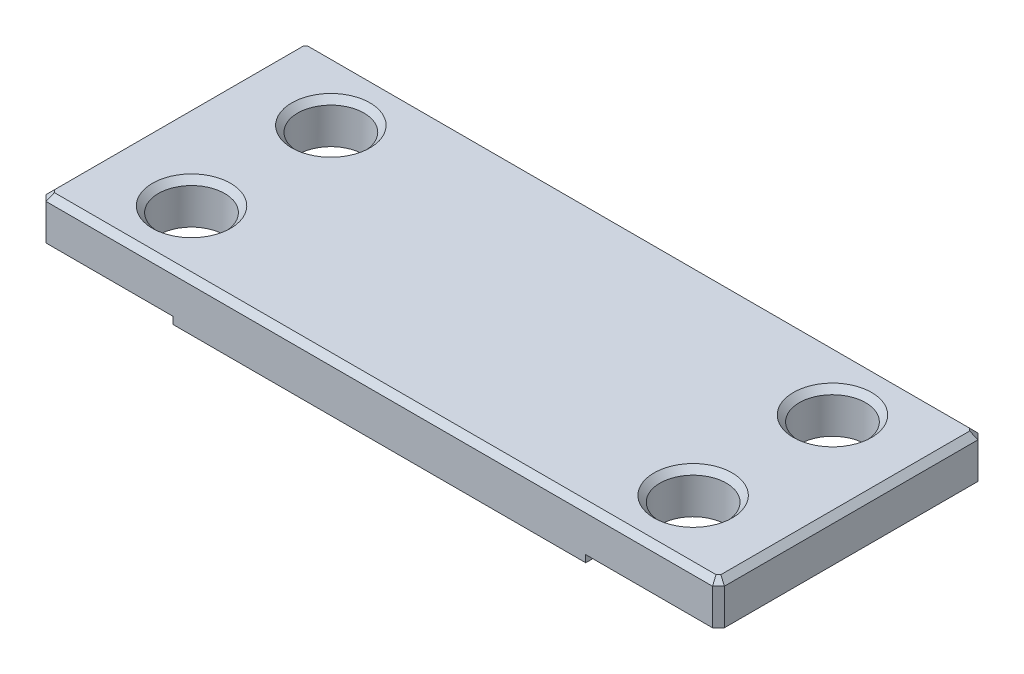
ISO-10303-21;
HEADER;
FILE_DESCRIPTION(('STEP AP214'),'2;1');
FILE_NAME('part.step','',(''),(''),'','','');
FILE_SCHEMA(('AUTOMOTIVE_DESIGN { 1 0 10303 214 1 1 1 1 }'));
ENDSEC;
DATA;
#1=APPLICATION_CONTEXT('core data for automotive mechanical design processes');
#2=APPLICATION_PROTOCOL_DEFINITION('international standard','automotive_design',2000,#1);
#3=PRODUCT_CONTEXT('',#1,'mechanical');
#4=PRODUCT('Part','Part','',(#3));
#5=PRODUCT_RELATED_PRODUCT_CATEGORY('part','',(#4));
#6=PRODUCT_DEFINITION_FORMATION('','',#4);
#7=PRODUCT_DEFINITION_CONTEXT('part definition',#1,'design');
#8=PRODUCT_DEFINITION('design','',#6,#7);
#9=PRODUCT_DEFINITION_SHAPE('','',#8);
#10=(LENGTH_UNIT() NAMED_UNIT(*) SI_UNIT(.MILLI.,.METRE.));
#11=(NAMED_UNIT(*) PLANE_ANGLE_UNIT() SI_UNIT($,.RADIAN.));
#12=(NAMED_UNIT(*) SI_UNIT($,.STERADIAN.) SOLID_ANGLE_UNIT());
#13=UNCERTAINTY_MEASURE_WITH_UNIT(LENGTH_MEASURE(1.E-05),#10,'distance_accuracy_value','');
#14=(GEOMETRIC_REPRESENTATION_CONTEXT(3) GLOBAL_UNCERTAINTY_ASSIGNED_CONTEXT((#13)) GLOBAL_UNIT_ASSIGNED_CONTEXT((#10,
#11,#12)) REPRESENTATION_CONTEXT('',''));
#15=CARTESIAN_POINT('',(0.,0.,0.));
#16=DIRECTION('',(0.,0.,1.));
#17=DIRECTION('',(1.,0.,0.));
#18=AXIS2_PLACEMENT_3D('',#15,#16,#17);
#19=CARTESIAN_POINT('',(36.5125,5.2740052,-14.2875));
#20=DIRECTION('',(-1.,0.,0.));
#21=DIRECTION('',(0.,0.,1.));
#22=AXIS2_PLACEMENT_3D('',#19,#20,#21);
#23=PLANE('',#22);
#24=DIRECTION('',(0.,1.,0.));
#25=VECTOR('',#24,1.);
#26=CARTESIAN_POINT('',(36.5125,5.2740052,-13.6525));
#27=LINE('',#26,#25);
#28=CARTESIAN_POINT('',(36.5125,0.762,-13.6525));
#29=VERTEX_POINT('',#28);
#30=CARTESIAN_POINT('',(36.5125,4.63900519999999,-13.6525));
#31=VERTEX_POINT('',#30);
#32=EDGE_CURVE('E208',#29,#31,#27,.T.);
#33=ORIENTED_EDGE('',*,*,#32,.T.);
#34=DIRECTION('',(0.,0.,1.));
#35=VECTOR('',#34,1.);
#36=CARTESIAN_POINT('',(36.5125,4.63900519999999,13.6525));
#37=LINE('',#36,#35);
#38=CARTESIAN_POINT('',(36.5125,4.63900519999999,13.6525));
#39=VERTEX_POINT('',#38);
#40=EDGE_CURVE('E58',#31,#39,#37,.T.);
#41=ORIENTED_EDGE('',*,*,#40,.T.);
#42=DIRECTION('',(0.,-1.,0.));
#43=VECTOR('',#42,1.);
#44=CARTESIAN_POINT('',(36.5125,5.2740052,13.6525));
#45=LINE('',#44,#43);
#46=CARTESIAN_POINT('',(36.5125,0.762,13.6525));
#47=VERTEX_POINT('',#46);
#48=EDGE_CURVE('E217',#39,#47,#45,.T.);
#49=ORIENTED_EDGE('',*,*,#48,.T.);
#50=DIRECTION('',(0.,0.,1.));
#51=VECTOR('',#50,1.);
#52=CARTESIAN_POINT('',(36.5125,0.762,-14.2875));
#53=LINE('',#52,#51);
#54=EDGE_CURVE('E172',#29,#47,#53,.T.);
#55=ORIENTED_EDGE('',*,*,#54,.F.);
#56=EDGE_LOOP('',(#33,#41,#49,#55));
#57=FACE_BOUND('',#56,.T.);
#58=ADVANCED_FACE('F33',(#57),#23,.F.);
#59=CARTESIAN_POINT('',(-36.5125,5.2740052,-14.2875));
#60=DIRECTION('',(0.,0.,1.));
#61=DIRECTION('',(1.,0.,0.));
#62=AXIS2_PLACEMENT_3D('',#59,#60,#61);
#63=PLANE('',#62);
#64=DIRECTION('',(0.,1.,0.));
#65=VECTOR('',#64,1.);
#66=CARTESIAN_POINT('',(-35.8775,5.2740052,-14.2875));
#67=LINE('',#66,#65);
#68=CARTESIAN_POINT('',(-35.8775,0.762,-14.2875));
#69=VERTEX_POINT('',#68);
#70=CARTESIAN_POINT('',(-35.8775,4.63900519999999,-14.2875));
#71=VERTEX_POINT('',#70);
#72=EDGE_CURVE('E227',#69,#71,#67,.T.);
#73=ORIENTED_EDGE('',*,*,#72,.T.);
#74=DIRECTION('',(1.,0.,0.));
#75=VECTOR('',#74,1.);
#76=CARTESIAN_POINT('',(35.8775,4.63900519999999,-14.2875));
#77=LINE('',#76,#75);
#78=CARTESIAN_POINT('',(35.8775,4.63900519999999,-14.2875));
#79=VERTEX_POINT('',#78);
#80=EDGE_CURVE('E275',#71,#79,#77,.T.);
#81=ORIENTED_EDGE('',*,*,#80,.T.);
#82=DIRECTION('',(0.,-1.,0.));
#83=VECTOR('',#82,1.);
#84=CARTESIAN_POINT('',(35.8775,5.2740052,-14.2875));
#85=LINE('',#84,#83);
#86=CARTESIAN_POINT('',(35.8775,0.762,-14.2875));
#87=VERTEX_POINT('',#86);
#88=EDGE_CURVE('E158',#79,#87,#85,.T.);
#89=ORIENTED_EDGE('',*,*,#88,.T.);
#90=DIRECTION('',(-1.,0.,0.));
#91=VECTOR('',#90,1.);
#92=CARTESIAN_POINT('',(36.5125,0.762,-14.2875));
#93=LINE('',#92,#91);
#94=CARTESIAN_POINT('',(22.225,0.762,-14.2875));
#95=VERTEX_POINT('',#94);
#96=EDGE_CURVE('E150',#87,#95,#93,.T.);
#97=ORIENTED_EDGE('',*,*,#96,.T.);
#98=DIRECTION('',(0.,-1.,0.));
#99=VECTOR('',#98,1.);
#100=CARTESIAN_POINT('',(22.225,0.,-14.2875));
#101=LINE('',#100,#99);
#102=CARTESIAN_POINT('',(22.225,0.,-14.2875));
#103=VERTEX_POINT('',#102);
#104=EDGE_CURVE('E155',#95,#103,#101,.T.);
#105=ORIENTED_EDGE('',*,*,#104,.T.);
#106=DIRECTION('',(-1.,0.,0.));
#107=VECTOR('',#106,1.);
#108=CARTESIAN_POINT('',(-36.5125,0.,-14.2875));
#109=LINE('',#108,#107);
#110=CARTESIAN_POINT('',(-22.225,0.,-14.2875));
#111=VERTEX_POINT('',#110);
#112=EDGE_CURVE('E200',#103,#111,#109,.T.);
#113=ORIENTED_EDGE('',*,*,#112,.T.);
#114=DIRECTION('',(0.,1.,0.));
#115=VECTOR('',#114,1.);
#116=CARTESIAN_POINT('',(-22.225,0.,-14.2875));
#117=LINE('',#116,#115);
#118=CARTESIAN_POINT('',(-22.225,0.762,-14.2875));
#119=VERTEX_POINT('',#118);
#120=EDGE_CURVE('E185',#111,#119,#117,.T.);
#121=ORIENTED_EDGE('',*,*,#120,.T.);
#122=DIRECTION('',(-1.,0.,0.));
#123=VECTOR('',#122,1.);
#124=CARTESIAN_POINT('',(-36.5125,0.762,-14.2875));
#125=LINE('',#124,#123);
#126=EDGE_CURVE('E188',#119,#69,#125,.T.);
#127=ORIENTED_EDGE('',*,*,#126,.T.);
#128=EDGE_LOOP('',(#73,#81,#89,#97,#105,#113,#121,#127));
#129=FACE_BOUND('',#128,.T.);
#130=ADVANCED_FACE('F153',(#129),#63,.F.);
#131=CARTESIAN_POINT('',(-36.5125,5.2740052,-14.2875));
#132=DIRECTION('',(1.,0.,0.));
#133=DIRECTION('',(0.,0.,-1.));
#134=AXIS2_PLACEMENT_3D('',#131,#132,#133);
#135=PLANE('',#134);
#136=DIRECTION('',(0.,1.,0.));
#137=VECTOR('',#136,1.);
#138=CARTESIAN_POINT('',(-36.5125,5.2740052,13.6525));
#139=LINE('',#138,#137);
#140=CARTESIAN_POINT('',(-36.5125,0.762,13.6525));
#141=VERTEX_POINT('',#140);
#142=CARTESIAN_POINT('',(-36.5125,4.63900519999999,13.6525));
#143=VERTEX_POINT('',#142);
#144=EDGE_CURVE('E230',#141,#143,#139,.T.);
#145=ORIENTED_EDGE('',*,*,#144,.T.);
#146=DIRECTION('',(0.,0.,-1.));
#147=VECTOR('',#146,1.);
#148=CARTESIAN_POINT('',(-36.5125,4.63900519999999,-13.6525));
#149=LINE('',#148,#147);
#150=CARTESIAN_POINT('',(-36.5125,4.63900519999999,-13.6525));
#151=VERTEX_POINT('',#150);
#152=EDGE_CURVE('E271',#143,#151,#149,.T.);
#153=ORIENTED_EDGE('',*,*,#152,.T.);
#154=DIRECTION('',(0.,-1.,0.));
#155=VECTOR('',#154,1.);
#156=CARTESIAN_POINT('',(-36.5125,5.2740052,-13.6525));
#157=LINE('',#156,#155);
#158=CARTESIAN_POINT('',(-36.5125,0.762,-13.6525));
#159=VERTEX_POINT('',#158);
#160=EDGE_CURVE('E233',#151,#159,#157,.T.);
#161=ORIENTED_EDGE('',*,*,#160,.T.);
#162=DIRECTION('',(0.,0.,1.));
#163=VECTOR('',#162,1.);
#164=CARTESIAN_POINT('',(-36.5125,0.762,-14.2875));
#165=LINE('',#164,#163);
#166=EDGE_CURVE('E197',#159,#141,#165,.T.);
#167=ORIENTED_EDGE('',*,*,#166,.T.);
#168=EDGE_LOOP('',(#145,#153,#161,#167));
#169=FACE_BOUND('',#168,.T.);
#170=ADVANCED_FACE('F349',(#169),#135,.F.);
#171=CARTESIAN_POINT('',(-36.5125,5.2740052,14.2875));
#172=DIRECTION('',(0.,0.,-1.));
#173=DIRECTION('',(-1.,0.,0.));
#174=AXIS2_PLACEMENT_3D('',#171,#172,#173);
#175=PLANE('',#174);
#176=DIRECTION('',(0.,1.,0.));
#177=VECTOR('',#176,1.);
#178=CARTESIAN_POINT('',(35.8775,5.2740052,14.2875));
#179=LINE('',#178,#177);
#180=CARTESIAN_POINT('',(35.8775,0.762,14.2875));
#181=VERTEX_POINT('',#180);
#182=CARTESIAN_POINT('',(35.8775,4.63900519999999,14.2875));
#183=VERTEX_POINT('',#182);
#184=EDGE_CURVE('E225',#181,#183,#179,.T.);
#185=ORIENTED_EDGE('',*,*,#184,.T.);
#186=DIRECTION('',(-1.,0.,0.));
#187=VECTOR('',#186,1.);
#188=CARTESIAN_POINT('',(-35.8775,4.63900519999999,14.2875));
#189=LINE('',#188,#187);
#190=CARTESIAN_POINT('',(-35.8775,4.63900519999999,14.2875));
#191=VERTEX_POINT('',#190);
#192=EDGE_CURVE('E281',#183,#191,#189,.T.);
#193=ORIENTED_EDGE('',*,*,#192,.T.);
#194=DIRECTION('',(0.,-1.,0.));
#195=VECTOR('',#194,1.);
#196=CARTESIAN_POINT('',(-35.8775,5.2740052,14.2875));
#197=LINE('',#196,#195);
#198=CARTESIAN_POINT('',(-35.8775,0.762,14.2875));
#199=VERTEX_POINT('',#198);
#200=EDGE_CURVE('E223',#191,#199,#197,.T.);
#201=ORIENTED_EDGE('',*,*,#200,.T.);
#202=DIRECTION('',(-1.,0.,0.));
#203=VECTOR('',#202,1.);
#204=CARTESIAN_POINT('',(-36.5125,0.762,14.2875));
#205=LINE('',#204,#203);
#206=CARTESIAN_POINT('',(-22.225,0.762,14.2875));
#207=VERTEX_POINT('',#206);
#208=EDGE_CURVE('E189',#207,#199,#205,.T.);
#209=ORIENTED_EDGE('',*,*,#208,.F.);
#210=DIRECTION('',(0.,1.,0.));
#211=VECTOR('',#210,1.);
#212=CARTESIAN_POINT('',(-22.225,0.,14.2875));
#213=LINE('',#212,#211);
#214=CARTESIAN_POINT('',(-22.225,0.,14.2875));
#215=VERTEX_POINT('',#214);
#216=EDGE_CURVE('E183',#215,#207,#213,.T.);
#217=ORIENTED_EDGE('',*,*,#216,.F.);
#218=DIRECTION('',(1.,0.,0.));
#219=VECTOR('',#218,1.);
#220=CARTESIAN_POINT('',(-36.5125,0.,14.2875));
#221=LINE('',#220,#219);
#222=CARTESIAN_POINT('',(22.225,0.,14.2875));
#223=VERTEX_POINT('',#222);
#224=EDGE_CURVE('E205',#215,#223,#221,.T.);
#225=ORIENTED_EDGE('',*,*,#224,.T.);
#226=DIRECTION('',(0.,-1.,0.));
#227=VECTOR('',#226,1.);
#228=CARTESIAN_POINT('',(22.225,0.,14.2875));
#229=LINE('',#228,#227);
#230=CARTESIAN_POINT('',(22.225,0.762,14.2875));
#231=VERTEX_POINT('',#230);
#232=EDGE_CURVE('E161',#231,#223,#229,.T.);
#233=ORIENTED_EDGE('',*,*,#232,.F.);
#234=DIRECTION('',(-1.,0.,0.));
#235=VECTOR('',#234,1.);
#236=CARTESIAN_POINT('',(36.5125,0.762,14.2875));
#237=LINE('',#236,#235);
#238=EDGE_CURVE('E168',#181,#231,#237,.T.);
#239=ORIENTED_EDGE('',*,*,#238,.F.);
#240=EDGE_LOOP('',(#185,#193,#201,#209,#217,#225,#233,#239));
#241=FACE_BOUND('',#240,.T.);
#242=ADVANCED_FACE('F328',(#241),#175,.F.);
#243=CARTESIAN_POINT('',(0.,5.2740052,0.));
#244=DIRECTION('',(0.,1.,0.));
#245=DIRECTION('',(0.,0.,1.));
#246=AXIS2_PLACEMENT_3D('',#243,#244,#245);
#247=PLANE('',#246);
#248=DIRECTION('',(0.,0.,1.));
#249=VECTOR('',#248,1.);
#250=CARTESIAN_POINT('',(-35.8775,5.2740052,13.6525));
#251=LINE('',#250,#249);
#252=CARTESIAN_POINT('',(-35.8775,5.2740052,-13.3894743878931));
#253=VERTEX_POINT('',#252);
#254=CARTESIAN_POINT('',(-35.8775,5.2740052,13.3894743878931));
#255=VERTEX_POINT('',#254);
#256=EDGE_CURVE('E263',#253,#255,#251,.T.);
#257=ORIENTED_EDGE('',*,*,#256,.T.);
#258=DIRECTION('',(0.707106781186551,0.,0.707106781186544));
#259=VECTOR('',#258,1.);
#260=CARTESIAN_POINT('',(-24.6334871939463,5.2740052,24.6334871939466));
#261=LINE('',#260,#259);
#262=CARTESIAN_POINT('',(-35.6144743878931,5.2740052,13.6525));
#263=VERTEX_POINT('',#262);
#264=EDGE_CURVE('E265',#255,#263,#261,.T.);
#265=ORIENTED_EDGE('',*,*,#264,.T.);
#266=DIRECTION('',(1.,0.,0.));
#267=VECTOR('',#266,1.);
#268=CARTESIAN_POINT('',(35.8775,5.2740052,13.6525));
#269=LINE('',#268,#267);
#270=CARTESIAN_POINT('',(35.6144743878931,5.2740052,13.6525));
#271=VERTEX_POINT('',#270);
#272=EDGE_CURVE('E251',#263,#271,#269,.T.);
#273=ORIENTED_EDGE('',*,*,#272,.T.);
#274=DIRECTION('',(0.707106781186548,0.,-0.707106781186548));
#275=VECTOR('',#274,1.);
#276=CARTESIAN_POINT('',(24.6334871939465,5.2740052,24.6334871939465));
#277=LINE('',#276,#275);
#278=CARTESIAN_POINT('',(35.8775,5.2740052,13.3894743878931));
#279=VERTEX_POINT('',#278);
#280=EDGE_CURVE('E253',#271,#279,#277,.T.);
#281=ORIENTED_EDGE('',*,*,#280,.T.);
#282=DIRECTION('',(0.,0.,-1.));
#283=VECTOR('',#282,1.);
#284=CARTESIAN_POINT('',(35.8775,5.2740052,-13.6525));
#285=LINE('',#284,#283);
#286=CARTESIAN_POINT('',(35.8775,5.2740052,-13.3894743878931));
#287=VERTEX_POINT('',#286);
#288=EDGE_CURVE('E255',#279,#287,#285,.T.);
#289=ORIENTED_EDGE('',*,*,#288,.T.);
#290=DIRECTION('',(-0.707106781186551,0.,-0.707106781186544));
#291=VECTOR('',#290,1.);
#292=CARTESIAN_POINT('',(24.6334871939463,5.2740052,-24.6334871939466));
#293=LINE('',#292,#291);
#294=CARTESIAN_POINT('',(35.6144743878931,5.2740052,-13.6525));
#295=VERTEX_POINT('',#294);
#296=EDGE_CURVE('E257',#287,#295,#293,.T.);
#297=ORIENTED_EDGE('',*,*,#296,.T.);
#298=DIRECTION('',(-1.,0.,0.));
#299=VECTOR('',#298,1.);
#300=CARTESIAN_POINT('',(-35.8775,5.2740052,-13.6525));
#301=LINE('',#300,#299);
#302=CARTESIAN_POINT('',(-35.6144743878931,5.2740052,-13.6525));
#303=VERTEX_POINT('',#302);
#304=EDGE_CURVE('E259',#295,#303,#301,.T.);
#305=ORIENTED_EDGE('',*,*,#304,.T.);
#306=DIRECTION('',(-0.707106781186548,0.,0.707106781186548));
#307=VECTOR('',#306,1.);
#308=CARTESIAN_POINT('',(-24.6334871939465,5.2740052,-24.6334871939465));
#309=LINE('',#308,#307);
#310=EDGE_CURVE('E261',#303,#253,#309,.T.);
#311=ORIENTED_EDGE('',*,*,#310,.T.);
#312=EDGE_LOOP('',(#257,#265,#273,#281,#289,#297,#305,#311));
#313=FACE_BOUND('',#312,.T.);
#314=CARTESIAN_POINT('',(-27.,5.2740052,7.5));
#315=DIRECTION('',(0.,1.,0.));
#316=DIRECTION('',(0.,0.,1.));
#317=AXIS2_PLACEMENT_3D('',#314,#315,#316);
#318=CIRCLE('',#317,4.206875);
#319=CARTESIAN_POINT('',(-27.,5.2740052,11.706875));
#320=VERTEX_POINT('',#319);
#321=EDGE_CURVE('E248',#320,#320,#318,.F.);
#322=ORIENTED_EDGE('',*,*,#321,.T.);
#323=EDGE_LOOP('',(#322));
#324=FACE_BOUND('',#323,.T.);
#325=CARTESIAN_POINT('',(27.,5.2740052,-7.5));
#326=DIRECTION('',(0.,1.,0.));
#327=DIRECTION('',(0.,0.,1.));
#328=AXIS2_PLACEMENT_3D('',#325,#326,#327);
#329=CIRCLE('',#328,4.206875);
#330=CARTESIAN_POINT('',(27.,5.2740052,-3.293125));
#331=VERTEX_POINT('',#330);
#332=EDGE_CURVE('E245',#331,#331,#329,.F.);
#333=ORIENTED_EDGE('',*,*,#332,.T.);
#334=EDGE_LOOP('',(#333));
#335=FACE_BOUND('',#334,.T.);
#336=CARTESIAN_POINT('',(27.,5.2740052,7.5));
#337=DIRECTION('',(0.,1.,0.));
#338=DIRECTION('',(0.,0.,1.));
#339=AXIS2_PLACEMENT_3D('',#336,#337,#338);
#340=CIRCLE('',#339,4.206875);
#341=CARTESIAN_POINT('',(27.,5.2740052,11.706875));
#342=VERTEX_POINT('',#341);
#343=EDGE_CURVE('E242',#342,#342,#340,.F.);
#344=ORIENTED_EDGE('',*,*,#343,.T.);
#345=EDGE_LOOP('',(#344));
#346=FACE_BOUND('',#345,.T.);
#347=CARTESIAN_POINT('',(-27.,5.2740052,-7.5));
#348=DIRECTION('',(0.,1.,0.));
#349=DIRECTION('',(0.,0.,1.));
#350=AXIS2_PLACEMENT_3D('',#347,#348,#349);
#351=CIRCLE('',#350,4.206875);
#352=CARTESIAN_POINT('',(-27.,5.2740052,-3.293125));
#353=VERTEX_POINT('',#352);
#354=EDGE_CURVE('E239',#353,#353,#351,.F.);
#355=ORIENTED_EDGE('',*,*,#354,.T.);
#356=EDGE_LOOP('',(#355));
#357=FACE_BOUND('',#356,.T.);
#358=ADVANCED_FACE('F357',(#313,#324,#335,#346,#357),#247,.T.);
#359=CARTESIAN_POINT('',(0.,0.,0.));
#360=DIRECTION('',(0.,1.,0.));
#361=DIRECTION('',(0.,0.,1.));
#362=AXIS2_PLACEMENT_3D('',#359,#360,#361);
#363=PLANE('',#362);
#364=ORIENTED_EDGE('',*,*,#112,.F.);
#365=DIRECTION('',(0.,0.,1.));
#366=VECTOR('',#365,1.);
#367=CARTESIAN_POINT('',(22.225,0.,-14.2875));
#368=LINE('',#367,#366);
#369=EDGE_CURVE('E171',#103,#223,#368,.T.);
#370=ORIENTED_EDGE('',*,*,#369,.T.);
#371=ORIENTED_EDGE('',*,*,#224,.F.);
#372=DIRECTION('',(0.,0.,1.));
#373=VECTOR('',#372,1.);
#374=CARTESIAN_POINT('',(-22.225,0.,-14.2875));
#375=LINE('',#374,#373);
#376=EDGE_CURVE('E192',#111,#215,#375,.T.);
#377=ORIENTED_EDGE('',*,*,#376,.F.);
#378=EDGE_LOOP('',(#364,#370,#371,#377));
#379=FACE_BOUND('',#378,.T.);
#380=ADVANCED_FACE('F358',(#379),#363,.F.);
#381=CARTESIAN_POINT('',(-36.5125,0.762,-14.2875));
#382=DIRECTION('',(0.,1.,0.));
#383=DIRECTION('',(-1.,0.,0.));
#384=AXIS2_PLACEMENT_3D('',#381,#382,#383);
#385=PLANE('',#384);
#386=CARTESIAN_POINT('',(-27.,0.762000000000001,-7.5));
#387=DIRECTION('',(0.,1.,0.));
#388=DIRECTION('',(-1.,0.,0.));
#389=AXIS2_PLACEMENT_3D('',#386,#387,#388);
#390=CIRCLE('',#389,3.571875);
#391=CARTESIAN_POINT('',(-30.571875,0.762000000000001,-7.5));
#392=VERTEX_POINT('',#391);
#393=EDGE_CURVE('E213',#392,#392,#390,.T.);
#394=ORIENTED_EDGE('',*,*,#393,.T.);
#395=EDGE_LOOP('',(#394));
#396=FACE_BOUND('',#395,.T.);
#397=CARTESIAN_POINT('',(-27.,0.762000000000001,7.5));
#398=DIRECTION('',(0.,1.,0.));
#399=DIRECTION('',(-1.,0.,0.));
#400=AXIS2_PLACEMENT_3D('',#397,#398,#399);
#401=CIRCLE('',#400,3.571875);
#402=CARTESIAN_POINT('',(-30.571875,0.762000000000001,7.5));
#403=VERTEX_POINT('',#402);
#404=EDGE_CURVE('E181',#403,#403,#401,.T.);
#405=ORIENTED_EDGE('',*,*,#404,.T.);
#406=EDGE_LOOP('',(#405));
#407=FACE_BOUND('',#406,.T.);
#408=ORIENTED_EDGE('',*,*,#166,.F.);
#409=DIRECTION('',(-0.707106781186548,0.,0.707106781186548));
#410=VECTOR('',#409,1.);
#411=CARTESIAN_POINT('',(-36.5125,0.762000000000001,-13.6525));
#412=LINE('',#411,#410);
#413=EDGE_CURVE('E237',#159,#69,#412,.F.);
#414=ORIENTED_EDGE('',*,*,#413,.T.);
#415=ORIENTED_EDGE('',*,*,#126,.F.);
#416=DIRECTION('',(0.,0.,1.));
#417=VECTOR('',#416,1.);
#418=CARTESIAN_POINT('',(-22.225,0.762,-14.2875));
#419=LINE('',#418,#417);
#420=EDGE_CURVE('E201',#119,#207,#419,.T.);
#421=ORIENTED_EDGE('',*,*,#420,.T.);
#422=ORIENTED_EDGE('',*,*,#208,.T.);
#423=DIRECTION('',(0.707106781186551,0.,0.707106781186544));
#424=VECTOR('',#423,1.);
#425=CARTESIAN_POINT('',(-35.8775,0.762000000000001,14.2875));
#426=LINE('',#425,#424);
#427=EDGE_CURVE('E235',#199,#141,#426,.F.);
#428=ORIENTED_EDGE('',*,*,#427,.T.);
#429=EDGE_LOOP('',(#408,#414,#415,#421,#422,#428));
#430=FACE_BOUND('',#429,.T.);
#431=ADVANCED_FACE('F361',(#396,#407,#430),#385,.F.);
#432=CARTESIAN_POINT('',(-22.225,0.,-14.2875));
#433=DIRECTION('',(1.,0.,0.));
#434=DIRECTION('',(0.,0.,-1.));
#435=AXIS2_PLACEMENT_3D('',#432,#433,#434);
#436=PLANE('',#435);
#437=ORIENTED_EDGE('',*,*,#216,.T.);
#438=ORIENTED_EDGE('',*,*,#420,.F.);
#439=ORIENTED_EDGE('',*,*,#120,.F.);
#440=ORIENTED_EDGE('',*,*,#376,.T.);
#441=EDGE_LOOP('',(#437,#438,#439,#440));
#442=FACE_BOUND('',#441,.T.);
#443=ADVANCED_FACE('F366',(#442),#436,.F.);
#444=CARTESIAN_POINT('',(22.225,0.,-14.2875));
#445=DIRECTION('',(-1.,0.,0.));
#446=DIRECTION('',(0.,0.,1.));
#447=AXIS2_PLACEMENT_3D('',#444,#445,#446);
#448=PLANE('',#447);
#449=ORIENTED_EDGE('',*,*,#232,.T.);
#450=ORIENTED_EDGE('',*,*,#369,.F.);
#451=ORIENTED_EDGE('',*,*,#104,.F.);
#452=DIRECTION('',(0.,0.,1.));
#453=VECTOR('',#452,1.);
#454=CARTESIAN_POINT('',(22.225,0.762,-14.2875));
#455=LINE('',#454,#453);
#456=EDGE_CURVE('E164',#95,#231,#455,.T.);
#457=ORIENTED_EDGE('',*,*,#456,.T.);
#458=EDGE_LOOP('',(#449,#450,#451,#457));
#459=FACE_BOUND('',#458,.T.);
#460=ADVANCED_FACE('F174',(#459),#448,.F.);
#461=CARTESIAN_POINT('',(36.5125,0.762,-14.2875));
#462=DIRECTION('',(0.,1.,0.));
#463=DIRECTION('',(0.,0.,1.));
#464=AXIS2_PLACEMENT_3D('',#461,#462,#463);
#465=PLANE('',#464);
#466=CARTESIAN_POINT('',(27.,0.762,7.5));
#467=DIRECTION('',(0.,1.,0.));
#468=DIRECTION('',(0.,0.,1.));
#469=AXIS2_PLACEMENT_3D('',#466,#467,#468);
#470=CIRCLE('',#469,3.571875);
#471=CARTESIAN_POINT('',(27.,0.762,11.071875));
#472=VERTEX_POINT('',#471);
#473=EDGE_CURVE('E209',#472,#472,#470,.T.);
#474=ORIENTED_EDGE('',*,*,#473,.T.);
#475=EDGE_LOOP('',(#474));
#476=FACE_BOUND('',#475,.T.);
#477=CARTESIAN_POINT('',(27.,0.762,-7.5));
#478=DIRECTION('',(0.,1.,0.));
#479=DIRECTION('',(0.,0.,1.));
#480=AXIS2_PLACEMENT_3D('',#477,#478,#479);
#481=CIRCLE('',#480,3.571875);
#482=CARTESIAN_POINT('',(27.,0.762,-3.928125));
#483=VERTEX_POINT('',#482);
#484=EDGE_CURVE('E212',#483,#483,#481,.T.);
#485=ORIENTED_EDGE('',*,*,#484,.T.);
#486=EDGE_LOOP('',(#485));
#487=FACE_BOUND('',#486,.T.);
#488=ORIENTED_EDGE('',*,*,#54,.T.);
#489=DIRECTION('',(0.707106781186548,0.,-0.707106781186548));
#490=VECTOR('',#489,1.);
#491=CARTESIAN_POINT('',(36.5125,0.762,13.6525));
#492=LINE('',#491,#490);
#493=EDGE_CURVE('E221',#47,#181,#492,.F.);
#494=ORIENTED_EDGE('',*,*,#493,.T.);
#495=ORIENTED_EDGE('',*,*,#238,.T.);
#496=ORIENTED_EDGE('',*,*,#456,.F.);
#497=ORIENTED_EDGE('',*,*,#96,.F.);
#498=DIRECTION('',(-0.707106781186551,0.,-0.707106781186544));
#499=VECTOR('',#498,1.);
#500=CARTESIAN_POINT('',(35.8775,0.762,-14.2875));
#501=LINE('',#500,#499);
#502=EDGE_CURVE('E219',#87,#29,#501,.F.);
#503=ORIENTED_EDGE('',*,*,#502,.T.);
#504=EDGE_LOOP('',(#488,#494,#495,#496,#497,#503));
#505=FACE_BOUND('',#504,.T.);
#506=ADVANCED_FACE('F166',(#476,#487,#505),#465,.F.);
#507=CARTESIAN_POINT('',(-27.,5.2740052,7.5));
#508=DIRECTION('',(0.,1.,0.));
#509=DIRECTION('',(0.,0.,1.));
#510=AXIS2_PLACEMENT_3D('',#507,#508,#509);
#511=CYLINDRICAL_SURFACE('',#510,3.571875);
#512=CARTESIAN_POINT('',(-27.,4.63900520000001,7.5));
#513=DIRECTION('',(0.,1.,0.));
#514=DIRECTION('',(0.,0.,1.));
#515=AXIS2_PLACEMENT_3D('',#512,#513,#514);
#516=CIRCLE('',#515,3.571875);
#517=CARTESIAN_POINT('',(-27.,4.63900520000001,11.071875));
#518=VERTEX_POINT('',#517);
#519=EDGE_CURVE('E283',#518,#518,#516,.T.);
#520=ORIENTED_EDGE('',*,*,#519,.T.);
#521=EDGE_LOOP('',(#520));
#522=FACE_BOUND('',#521,.T.);
#523=ORIENTED_EDGE('',*,*,#404,.F.);
#524=EDGE_LOOP('',(#523));
#525=FACE_BOUND('',#524,.T.);
#526=ADVANCED_FACE('F375',(#522,#525),#511,.F.);
#527=CARTESIAN_POINT('',(27.,5.2740052,-7.5));
#528=DIRECTION('',(0.,1.,0.));
#529=DIRECTION('',(0.,0.,1.));
#530=AXIS2_PLACEMENT_3D('',#527,#528,#529);
#531=CYLINDRICAL_SURFACE('',#530,3.571875);
#532=CARTESIAN_POINT('',(27.,4.63900520000001,-7.5));
#533=DIRECTION('',(0.,1.,0.));
#534=DIRECTION('',(0.,0.,1.));
#535=AXIS2_PLACEMENT_3D('',#532,#533,#534);
#536=CIRCLE('',#535,3.571875);
#537=CARTESIAN_POINT('',(27.,4.63900520000001,-3.928125));
#538=VERTEX_POINT('',#537);
#539=EDGE_CURVE('E286',#538,#538,#536,.T.);
#540=ORIENTED_EDGE('',*,*,#539,.T.);
#541=EDGE_LOOP('',(#540));
#542=FACE_BOUND('',#541,.T.);
#543=ORIENTED_EDGE('',*,*,#484,.F.);
#544=EDGE_LOOP('',(#543));
#545=FACE_BOUND('',#544,.T.);
#546=ADVANCED_FACE('F381',(#542,#545),#531,.F.);
#547=CARTESIAN_POINT('',(27.,5.2740052,7.5));
#548=DIRECTION('',(0.,1.,0.));
#549=DIRECTION('',(0.,0.,1.));
#550=AXIS2_PLACEMENT_3D('',#547,#548,#549);
#551=CYLINDRICAL_SURFACE('',#550,3.571875);
#552=CARTESIAN_POINT('',(27.,4.63900520000001,7.5));
#553=DIRECTION('',(0.,1.,0.));
#554=DIRECTION('',(0.,0.,1.));
#555=AXIS2_PLACEMENT_3D('',#552,#553,#554);
#556=CIRCLE('',#555,3.571875);
#557=CARTESIAN_POINT('',(27.,4.63900520000001,11.071875));
#558=VERTEX_POINT('',#557);
#559=EDGE_CURVE('E42',#558,#558,#556,.T.);
#560=ORIENTED_EDGE('',*,*,#559,.T.);
#561=EDGE_LOOP('',(#560));
#562=FACE_BOUND('',#561,.T.);
#563=ORIENTED_EDGE('',*,*,#473,.F.);
#564=EDGE_LOOP('',(#563));
#565=FACE_BOUND('',#564,.T.);
#566=ADVANCED_FACE('F341',(#562,#565),#551,.F.);
#567=CARTESIAN_POINT('',(-27.,5.2740052,-7.5));
#568=DIRECTION('',(0.,1.,0.));
#569=DIRECTION('',(0.,0.,1.));
#570=AXIS2_PLACEMENT_3D('',#567,#568,#569);
#571=CYLINDRICAL_SURFACE('',#570,3.571875);
#572=CARTESIAN_POINT('',(-27.,4.63900520000001,-7.5));
#573=DIRECTION('',(0.,1.,0.));
#574=DIRECTION('',(0.,0.,1.));
#575=AXIS2_PLACEMENT_3D('',#572,#573,#574);
#576=CIRCLE('',#575,3.571875);
#577=CARTESIAN_POINT('',(-27.,4.63900520000001,-3.928125));
#578=VERTEX_POINT('',#577);
#579=EDGE_CURVE('E11',#578,#578,#576,.T.);
#580=ORIENTED_EDGE('',*,*,#579,.T.);
#581=EDGE_LOOP('',(#580));
#582=FACE_BOUND('',#581,.T.);
#583=ORIENTED_EDGE('',*,*,#393,.F.);
#584=EDGE_LOOP('',(#583));
#585=FACE_BOUND('',#584,.T.);
#586=ADVANCED_FACE('F333',(#582,#585),#571,.F.);
#587=CARTESIAN_POINT('',(36.5125,5.2740052,13.6525));
#588=DIRECTION('',(-0.707106781186547,0.,-0.707106781186547));
#589=DIRECTION('',(0.,-1.,0.));
#590=AXIS2_PLACEMENT_3D('',#587,#588,#589);
#591=PLANE('',#590);
#592=ORIENTED_EDGE('',*,*,#48,.F.);
#593=DIRECTION('',(0.707106781186548,0.,-0.707106781186548));
#594=VECTOR('',#593,1.);
#595=CARTESIAN_POINT('',(36.5125,4.63900519999999,13.6525));
#596=LINE('',#595,#594);
#597=EDGE_CURVE('E50',#39,#183,#596,.F.);
#598=ORIENTED_EDGE('',*,*,#597,.T.);
#599=ORIENTED_EDGE('',*,*,#184,.F.);
#600=ORIENTED_EDGE('',*,*,#493,.F.);
#601=EDGE_LOOP('',(#592,#598,#599,#600));
#602=FACE_BOUND('',#601,.T.);
#603=ADVANCED_FACE('F330',(#602),#591,.F.);
#604=CARTESIAN_POINT('',(35.8775,5.2740052,-14.2875));
#605=DIRECTION('',(-0.707106781186544,0.,0.707106781186551));
#606=DIRECTION('',(0.,-1.,0.));
#607=AXIS2_PLACEMENT_3D('',#604,#605,#606);
#608=PLANE('',#607);
#609=ORIENTED_EDGE('',*,*,#88,.F.);
#610=DIRECTION('',(-0.707106781186551,0.,-0.707106781186544));
#611=VECTOR('',#610,1.);
#612=CARTESIAN_POINT('',(35.8775,4.63900519999999,-14.2875));
#613=LINE('',#612,#611);
#614=EDGE_CURVE('E277',#79,#31,#613,.F.);
#615=ORIENTED_EDGE('',*,*,#614,.T.);
#616=ORIENTED_EDGE('',*,*,#32,.F.);
#617=ORIENTED_EDGE('',*,*,#502,.F.);
#618=EDGE_LOOP('',(#609,#615,#616,#617));
#619=FACE_BOUND('',#618,.T.);
#620=ADVANCED_FACE('F324',(#619),#608,.F.);
#621=CARTESIAN_POINT('',(-36.5125,5.2740052,-13.6525));
#622=DIRECTION('',(0.707106781186548,0.,0.707106781186548));
#623=DIRECTION('',(0.,-1.,0.));
#624=AXIS2_PLACEMENT_3D('',#621,#622,#623);
#625=PLANE('',#624);
#626=ORIENTED_EDGE('',*,*,#160,.F.);
#627=DIRECTION('',(-0.707106781186548,0.,0.707106781186548));
#628=VECTOR('',#627,1.);
#629=CARTESIAN_POINT('',(-36.5125,4.63900519999999,-13.6525));
#630=LINE('',#629,#628);
#631=EDGE_CURVE('E273',#151,#71,#630,.F.);
#632=ORIENTED_EDGE('',*,*,#631,.T.);
#633=ORIENTED_EDGE('',*,*,#72,.F.);
#634=ORIENTED_EDGE('',*,*,#413,.F.);
#635=EDGE_LOOP('',(#626,#632,#633,#634));
#636=FACE_BOUND('',#635,.T.);
#637=ADVANCED_FACE('F339',(#636),#625,.F.);
#638=CARTESIAN_POINT('',(-35.8775,5.2740052,14.2875));
#639=DIRECTION('',(0.707106781186544,0.,-0.707106781186551));
#640=DIRECTION('',(0.,-1.,0.));
#641=AXIS2_PLACEMENT_3D('',#638,#639,#640);
#642=PLANE('',#641);
#643=ORIENTED_EDGE('',*,*,#200,.F.);
#644=DIRECTION('',(0.707106781186551,0.,0.707106781186544));
#645=VECTOR('',#644,1.);
#646=CARTESIAN_POINT('',(-35.8775,4.63900519999999,14.2875));
#647=LINE('',#646,#645);
#648=EDGE_CURVE('E268',#191,#143,#647,.F.);
#649=ORIENTED_EDGE('',*,*,#648,.T.);
#650=ORIENTED_EDGE('',*,*,#144,.F.);
#651=ORIENTED_EDGE('',*,*,#427,.F.);
#652=EDGE_LOOP('',(#643,#649,#650,#651));
#653=FACE_BOUND('',#652,.T.);
#654=ADVANCED_FACE('F411',(#653),#642,.F.);
#655=CARTESIAN_POINT('',(24.6334871939463,5.2740052,-24.6334871939466));
#656=DIRECTION('',(0.499999999999996,0.70710678118655,-0.500000000000001));
#657=DIRECTION('',(0.707106781186551,0.,0.707106781186544));
#658=AXIS2_PLACEMENT_3D('',#655,#656,#657);
#659=PLANE('',#658);
#660=DIRECTION('',(-0.678598344545843,0.678598344545846,0.281084637714832));
#661=VECTOR('',#660,1.);
#662=CARTESIAN_POINT('',(33.3235438570985,7.82796134290149,-12.3315911157971));
#663=LINE('',#662,#661);
#664=EDGE_CURVE('E306',#31,#287,#663,.T.);
#665=ORIENTED_EDGE('',*,*,#664,.F.);
#666=ORIENTED_EDGE('',*,*,#614,.F.);
#667=DIRECTION('',(-0.281084637714824,0.678598344545846,0.678598344545846));
#668=VECTOR('',#667,1.);
#669=CARTESIAN_POINT('',(36.8414349510636,2.31186036789682,-16.6146448321032));
#670=LINE('',#669,#668);
#671=EDGE_CURVE('E37',#295,#79,#670,.F.);
#672=ORIENTED_EDGE('',*,*,#671,.F.);
#673=ORIENTED_EDGE('',*,*,#296,.F.);
#674=EDGE_LOOP('',(#665,#666,#672,#673));
#675=FACE_BOUND('',#674,.T.);
#676=ADVANCED_FACE('F321',(#675),#659,.T.);
#677=CARTESIAN_POINT('',(0.,5.2740052,-13.6525));
#678=DIRECTION('',(0.,0.707106781186548,-0.707106781186548));
#679=DIRECTION('',(1.,0.,0.));
#680=AXIS2_PLACEMENT_3D('',#677,#678,#679);
#681=PLANE('',#680);
#682=ORIENTED_EDGE('',*,*,#671,.T.);
#683=ORIENTED_EDGE('',*,*,#80,.F.);
#684=DIRECTION('',(0.281084637714826,0.678598344545846,0.678598344545846));
#685=VECTOR('',#684,1.);
#686=CARTESIAN_POINT('',(-32.8006255684423,12.0672371823854,-6.85926801761458));
#687=LINE('',#686,#685);
#688=EDGE_CURVE('E304',#303,#71,#687,.F.);
#689=ORIENTED_EDGE('',*,*,#688,.F.);
#690=ORIENTED_EDGE('',*,*,#304,.F.);
#691=EDGE_LOOP('',(#682,#683,#689,#690));
#692=FACE_BOUND('',#691,.T.);
#693=ADVANCED_FACE('F316',(#692),#681,.T.);
#694=CARTESIAN_POINT('',(35.8775,5.2740052,0.));
#695=DIRECTION('',(0.707106781186549,0.707106781186546,0.));
#696=DIRECTION('',(0.,0.,1.));
#697=AXIS2_PLACEMENT_3D('',#694,#695,#696);
#698=PLANE('',#697);
#699=ORIENTED_EDGE('',*,*,#664,.T.);
#700=ORIENTED_EDGE('',*,*,#288,.F.);
#701=DIRECTION('',(-0.678598344545843,0.678598344545847,-0.281084637714829));
#702=VECTOR('',#701,1.);
#703=CARTESIAN_POINT('',(32.8444034452646,8.30710175473539,12.1331246589345));
#704=LINE('',#703,#702);
#705=EDGE_CURVE('E301',#39,#279,#704,.T.);
#706=ORIENTED_EDGE('',*,*,#705,.F.);
#707=ORIENTED_EDGE('',*,*,#40,.F.);
#708=EDGE_LOOP('',(#699,#700,#706,#707));
#709=FACE_BOUND('',#708,.T.);
#710=ADVANCED_FACE('F437',(#709),#698,.T.);
#711=CARTESIAN_POINT('',(-24.6334871939465,5.2740052,-24.6334871939465));
#712=DIRECTION('',(-0.499999999999998,0.70710678118655,-0.499999999999998));
#713=DIRECTION('',(0.707106781186548,0.,-0.707106781186548));
#714=AXIS2_PLACEMENT_3D('',#711,#712,#713);
#715=PLANE('',#714);
#716=ORIENTED_EDGE('',*,*,#688,.T.);
#717=ORIENTED_EDGE('',*,*,#631,.F.);
#718=DIRECTION('',(0.678598344545846,0.678598344545846,0.281084637714826));
#719=VECTOR('',#718,1.);
#720=CARTESIAN_POINT('',(-32.8444034452646,8.30710175473543,-12.1331246589345));
#721=LINE('',#720,#719);
#722=EDGE_CURVE('E298',#253,#151,#721,.F.);
#723=ORIENTED_EDGE('',*,*,#722,.F.);
#724=ORIENTED_EDGE('',*,*,#310,.F.);
#725=EDGE_LOOP('',(#716,#717,#723,#724));
#726=FACE_BOUND('',#725,.T.);
#727=ADVANCED_FACE('F434',(#726),#715,.T.);
#728=CARTESIAN_POINT('',(24.6334871939465,5.2740052,24.6334871939465));
#729=DIRECTION('',(0.499999999999999,0.707106781186549,0.499999999999999));
#730=DIRECTION('',(-0.707106781186548,0.,0.707106781186548));
#731=AXIS2_PLACEMENT_3D('',#728,#729,#730);
#732=PLANE('',#731);
#733=ORIENTED_EDGE('',*,*,#705,.T.);
#734=ORIENTED_EDGE('',*,*,#280,.F.);
#735=DIRECTION('',(-0.281084637714825,0.678598344545846,-0.678598344545846));
#736=VECTOR('',#735,1.);
#737=CARTESIAN_POINT('',(32.8006255684423,12.0672371823854,6.8592680176146));
#738=LINE('',#737,#736);
#739=EDGE_CURVE('E295',#183,#271,#738,.T.);
#740=ORIENTED_EDGE('',*,*,#739,.F.);
#741=ORIENTED_EDGE('',*,*,#597,.F.);
#742=EDGE_LOOP('',(#733,#734,#740,#741));
#743=FACE_BOUND('',#742,.T.);
#744=ADVANCED_FACE('F436',(#743),#732,.T.);
#745=CARTESIAN_POINT('',(-35.8775,5.2740052,0.));
#746=DIRECTION('',(-0.707106781186548,0.707106781186548,0.));
#747=DIRECTION('',(0.,0.,-1.));
#748=AXIS2_PLACEMENT_3D('',#745,#746,#747);
#749=PLANE('',#748);
#750=ORIENTED_EDGE('',*,*,#722,.T.);
#751=ORIENTED_EDGE('',*,*,#152,.F.);
#752=DIRECTION('',(0.678598344545845,0.678598344545846,-0.281084637714827));
#753=VECTOR('',#752,1.);
#754=CARTESIAN_POINT('',(-33.3235438570985,7.82796134290144,12.3315911157972));
#755=LINE('',#754,#753);
#756=EDGE_CURVE('E293',#255,#143,#755,.F.);
#757=ORIENTED_EDGE('',*,*,#756,.F.);
#758=ORIENTED_EDGE('',*,*,#256,.F.);
#759=EDGE_LOOP('',(#750,#751,#757,#758));
#760=FACE_BOUND('',#759,.T.);
#761=ADVANCED_FACE('F429',(#760),#749,.T.);
#762=CARTESIAN_POINT('',(0.,5.2740052,13.6525));
#763=DIRECTION('',(0.,0.707106781186548,0.707106781186548));
#764=DIRECTION('',(-1.,0.,0.));
#765=AXIS2_PLACEMENT_3D('',#762,#763,#764);
#766=PLANE('',#765);
#767=ORIENTED_EDGE('',*,*,#739,.T.);
#768=ORIENTED_EDGE('',*,*,#272,.F.);
#769=DIRECTION('',(-0.281084637714823,-0.678598344545846,0.678598344545846));
#770=VECTOR('',#769,1.);
#771=CARTESIAN_POINT('',(-32.8006255684424,12.0672371823853,6.85926801761464));
#772=LINE('',#771,#770);
#773=EDGE_CURVE('E291',#191,#263,#772,.F.);
#774=ORIENTED_EDGE('',*,*,#773,.F.);
#775=ORIENTED_EDGE('',*,*,#192,.F.);
#776=EDGE_LOOP('',(#767,#768,#774,#775));
#777=FACE_BOUND('',#776,.T.);
#778=ADVANCED_FACE('F422',(#777),#766,.T.);
#779=CARTESIAN_POINT('',(-24.6334871939463,5.2740052,24.6334871939466));
#780=DIRECTION('',(-0.499999999999996,0.707106781186549,0.500000000000001));
#781=DIRECTION('',(-0.707106781186551,0.,-0.707106781186544));
#782=AXIS2_PLACEMENT_3D('',#779,#780,#781);
#783=PLANE('',#782);
#784=ORIENTED_EDGE('',*,*,#756,.T.);
#785=ORIENTED_EDGE('',*,*,#648,.F.);
#786=ORIENTED_EDGE('',*,*,#773,.T.);
#787=ORIENTED_EDGE('',*,*,#264,.F.);
#788=EDGE_LOOP('',(#784,#785,#786,#787));
#789=FACE_BOUND('',#788,.T.);
#790=ADVANCED_FACE('F415',(#789),#783,.T.);
#791=CARTESIAN_POINT('',(-27.,4.63900520000001,7.5));
#792=DIRECTION('',(0.,1.,0.));
#793=DIRECTION('',(0.,0.,1.));
#794=AXIS2_PLACEMENT_3D('',#791,#792,#793);
#795=CONICAL_SURFACE('',#794,3.571875,0.785398163397457);
#796=ORIENTED_EDGE('',*,*,#321,.F.);
#797=EDGE_LOOP('',(#796));
#798=FACE_BOUND('',#797,.T.);
#799=ORIENTED_EDGE('',*,*,#519,.F.);
#800=EDGE_LOOP('',(#799));
#801=FACE_BOUND('',#800,.T.);
#802=ADVANCED_FACE('F452',(#798,#801),#795,.F.);
#803=CARTESIAN_POINT('',(27.,4.63900520000001,-7.5));
#804=DIRECTION('',(0.,1.,0.));
#805=DIRECTION('',(0.,0.,1.));
#806=AXIS2_PLACEMENT_3D('',#803,#804,#805);
#807=CONICAL_SURFACE('',#806,3.571875,0.785398163397457);
#808=ORIENTED_EDGE('',*,*,#332,.F.);
#809=EDGE_LOOP('',(#808));
#810=FACE_BOUND('',#809,.T.);
#811=ORIENTED_EDGE('',*,*,#539,.F.);
#812=EDGE_LOOP('',(#811));
#813=FACE_BOUND('',#812,.T.);
#814=ADVANCED_FACE('F455',(#810,#813),#807,.F.);
#815=CARTESIAN_POINT('',(27.,4.63900520000001,7.5));
#816=DIRECTION('',(0.,1.,0.));
#817=DIRECTION('',(0.,0.,1.));
#818=AXIS2_PLACEMENT_3D('',#815,#816,#817);
#819=CONICAL_SURFACE('',#818,3.571875,0.785398163397457);
#820=ORIENTED_EDGE('',*,*,#343,.F.);
#821=EDGE_LOOP('',(#820));
#822=FACE_BOUND('',#821,.T.);
#823=ORIENTED_EDGE('',*,*,#559,.F.);
#824=EDGE_LOOP('',(#823));
#825=FACE_BOUND('',#824,.T.);
#826=ADVANCED_FACE('F458',(#822,#825),#819,.F.);
#827=CARTESIAN_POINT('',(-27.,4.63900520000001,-7.5));
#828=DIRECTION('',(0.,1.,0.));
#829=DIRECTION('',(0.,0.,1.));
#830=AXIS2_PLACEMENT_3D('',#827,#828,#829);
#831=CONICAL_SURFACE('',#830,3.571875,0.785398163397457);
#832=ORIENTED_EDGE('',*,*,#354,.F.);
#833=EDGE_LOOP('',(#832));
#834=FACE_BOUND('',#833,.T.);
#835=ORIENTED_EDGE('',*,*,#579,.F.);
#836=EDGE_LOOP('',(#835));
#837=FACE_BOUND('',#836,.T.);
#838=ADVANCED_FACE('F35',(#834,#837),#831,.F.);
#839=CLOSED_SHELL('',(#58,#130,#170,#242,#358,#380,#431,#443,#460,#506,#526,#546,#566,#586,#603,
#620,#637,#654,#676,#693,#710,#727,#744,#761,#778,#790,#802,#814,#826,#838));
#840=MANIFOLD_SOLID_BREP('B2',#839);
#841=ADVANCED_BREP_SHAPE_REPRESENTATION('',(#18,#840),#14);
#842=SHAPE_DEFINITION_REPRESENTATION(#9,#841);
ENDSEC;
END-ISO-10303-21;
